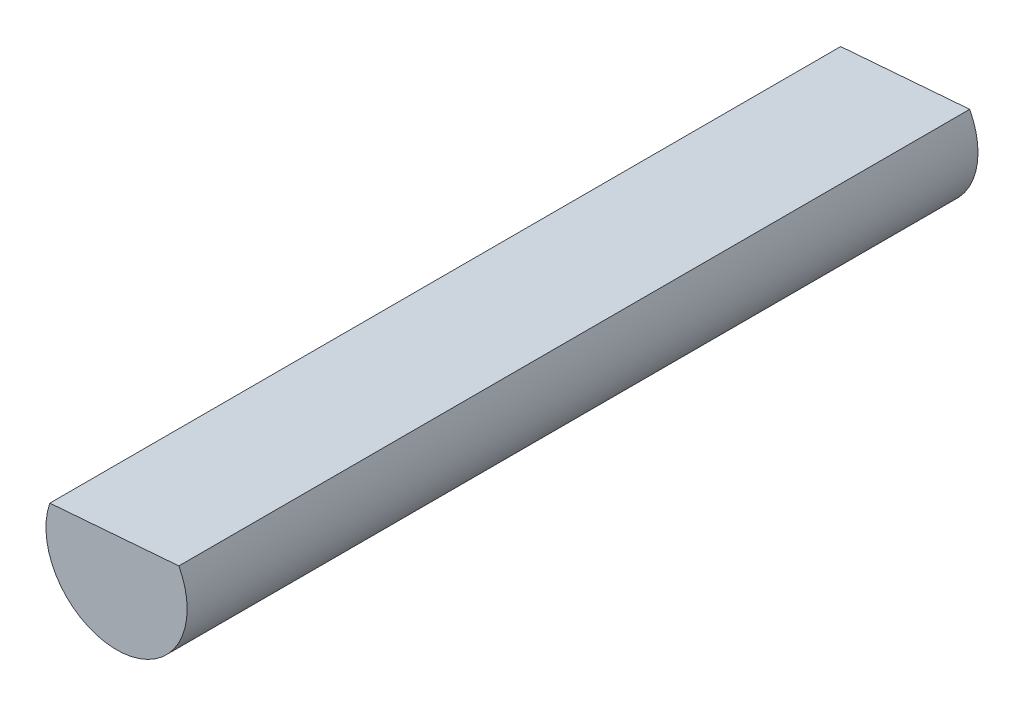
ISO-10303-21;
HEADER;
FILE_DESCRIPTION(('STEP AP214'),'2;1');
FILE_NAME('part.step','',(''),(''),'','','');
FILE_SCHEMA(('AUTOMOTIVE_DESIGN { 1 0 10303 214 1 1 1 1 }'));
ENDSEC;
DATA;
#1=APPLICATION_CONTEXT('core data for automotive mechanical design processes');
#2=APPLICATION_PROTOCOL_DEFINITION('international standard','automotive_design',2000,#1);
#3=PRODUCT_CONTEXT('',#1,'mechanical');
#4=PRODUCT('Part','Part','',(#3));
#5=PRODUCT_RELATED_PRODUCT_CATEGORY('part','',(#4));
#6=PRODUCT_DEFINITION_FORMATION('','',#4);
#7=PRODUCT_DEFINITION_CONTEXT('part definition',#1,'design');
#8=PRODUCT_DEFINITION('design','',#6,#7);
#9=PRODUCT_DEFINITION_SHAPE('','',#8);
#10=(LENGTH_UNIT() NAMED_UNIT(*) SI_UNIT(.MILLI.,.METRE.));
#11=(NAMED_UNIT(*) PLANE_ANGLE_UNIT() SI_UNIT($,.RADIAN.));
#12=(NAMED_UNIT(*) SI_UNIT($,.STERADIAN.) SOLID_ANGLE_UNIT());
#13=UNCERTAINTY_MEASURE_WITH_UNIT(LENGTH_MEASURE(1.E-05),#10,'distance_accuracy_value','');
#14=(GEOMETRIC_REPRESENTATION_CONTEXT(3) GLOBAL_UNCERTAINTY_ASSIGNED_CONTEXT((#13)) GLOBAL_UNIT_ASSIGNED_CONTEXT((#10,
#11,#12)) REPRESENTATION_CONTEXT('',''));
#15=CARTESIAN_POINT('',(0.,0.,0.));
#16=DIRECTION('',(0.,0.,1.));
#17=DIRECTION('',(1.,0.,0.));
#18=AXIS2_PLACEMENT_3D('',#15,#16,#17);
#19=CARTESIAN_POINT('',(0.,0.,56.));
#20=DIRECTION('',(0.,0.,-1.));
#21=DIRECTION('',(-1.,0.,0.));
#22=AXIS2_PLACEMENT_3D('',#19,#20,#21);
#23=CYLINDRICAL_SURFACE('',#22,5.);
#24=CARTESIAN_POINT('',(0.,0.,0.));
#25=DIRECTION('',(0.,0.,1.));
#26=DIRECTION('',(1.,0.,0.));
#27=AXIS2_PLACEMENT_3D('',#24,#25,#26);
#28=CIRCLE('',#27,5.);
#29=CARTESIAN_POINT('',(-4.7253673349013,1.63428992233563,0.));
#30=VERTEX_POINT('',#29);
#31=CARTESIAN_POINT('',(4.41153095198993,2.35337941259688,0.));
#32=VERTEX_POINT('',#31);
#33=EDGE_CURVE('E72',#30,#32,#28,.T.);
#34=ORIENTED_EDGE('',*,*,#33,.T.);
#35=DIRECTION('',(0.,0.,-1.));
#36=VECTOR('',#35,1.);
#37=CARTESIAN_POINT('',(4.41153095198993,2.35337941259688,56.));
#38=LINE('',#37,#36);
#39=CARTESIAN_POINT('',(4.41153095198993,2.35337941259688,56.));
#40=VERTEX_POINT('',#39);
#41=EDGE_CURVE('E11',#40,#32,#38,.T.);
#42=ORIENTED_EDGE('',*,*,#41,.F.);
#43=CARTESIAN_POINT('',(0.,0.,56.));
#44=DIRECTION('',(0.,0.,1.));
#45=DIRECTION('',(1.,0.,0.));
#46=AXIS2_PLACEMENT_3D('',#43,#44,#45);
#47=CIRCLE('',#46,5.);
#48=CARTESIAN_POINT('',(-4.7253673349013,1.63428992233563,56.));
#49=VERTEX_POINT('',#48);
#50=EDGE_CURVE('E71',#49,#40,#47,.T.);
#51=ORIENTED_EDGE('',*,*,#50,.F.);
#52=DIRECTION('',(0.,0.,-1.));
#53=VECTOR('',#52,1.);
#54=CARTESIAN_POINT('',(-4.7253673349013,1.63428992233563,56.));
#55=LINE('',#54,#53);
#56=EDGE_CURVE('E49',#49,#30,#55,.T.);
#57=ORIENTED_EDGE('',*,*,#56,.T.);
#58=EDGE_LOOP('',(#34,#42,#51,#57));
#59=FACE_BOUND('',#58,.T.);
#60=ADVANCED_FACE('F41',(#59),#23,.T.);
#61=CARTESIAN_POINT('',(4.41153095198993,2.35337941259688,56.));
#62=DIRECTION('',(0.0784590957278433,-0.996917333733128,0.));
#63=DIRECTION('',(0.996917333733128,0.0784590957278433,0.));
#64=AXIS2_PLACEMENT_3D('',#61,#62,#63);
#65=PLANE('',#64);
#66=DIRECTION('',(-0.996917333733128,-0.0784590957278433,0.));
#67=VECTOR('',#66,1.);
#68=CARTESIAN_POINT('',(4.41153095198993,2.35337941259688,0.));
#69=LINE('',#68,#67);
#70=EDGE_CURVE('E64',#32,#30,#69,.T.);
#71=ORIENTED_EDGE('',*,*,#70,.T.);
#72=ORIENTED_EDGE('',*,*,#56,.F.);
#73=DIRECTION('',(-0.996917333733128,-0.0784590957278433,0.));
#74=VECTOR('',#73,1.);
#75=CARTESIAN_POINT('',(4.41153095198993,2.35337941259688,56.));
#76=LINE('',#75,#74);
#77=EDGE_CURVE('E56',#40,#49,#76,.T.);
#78=ORIENTED_EDGE('',*,*,#77,.F.);
#79=ORIENTED_EDGE('',*,*,#41,.T.);
#80=EDGE_LOOP('',(#71,#72,#78,#79));
#81=FACE_BOUND('',#80,.T.);
#82=ADVANCED_FACE('F67',(#81),#65,.F.);
#83=CARTESIAN_POINT('',(0.,0.,56.));
#84=DIRECTION('',(0.,0.,1.));
#85=DIRECTION('',(1.,0.,0.));
#86=AXIS2_PLACEMENT_3D('',#83,#84,#85);
#87=PLANE('',#86);
#88=ORIENTED_EDGE('',*,*,#50,.T.);
#89=ORIENTED_EDGE('',*,*,#77,.T.);
#90=EDGE_LOOP('',(#88,#89));
#91=FACE_BOUND('',#90,.T.);
#92=ADVANCED_FACE('F79',(#91),#87,.T.);
#93=CARTESIAN_POINT('',(0.,0.,0.));
#94=DIRECTION('',(0.,0.,1.));
#95=DIRECTION('',(1.,0.,0.));
#96=AXIS2_PLACEMENT_3D('',#93,#94,#95);
#97=PLANE('',#96);
#98=ORIENTED_EDGE('',*,*,#33,.F.);
#99=ORIENTED_EDGE('',*,*,#70,.F.);
#100=EDGE_LOOP('',(#98,#99));
#101=FACE_BOUND('',#100,.T.);
#102=ADVANCED_FACE('F75',(#101),#97,.F.);
#103=CLOSED_SHELL('',(#60,#82,#92,#102));
#104=MANIFOLD_SOLID_BREP('B2',#103);
#105=ADVANCED_BREP_SHAPE_REPRESENTATION('',(#18,#104),#14);
#106=SHAPE_DEFINITION_REPRESENTATION(#9,#105);
ENDSEC;
END-ISO-10303-21;
